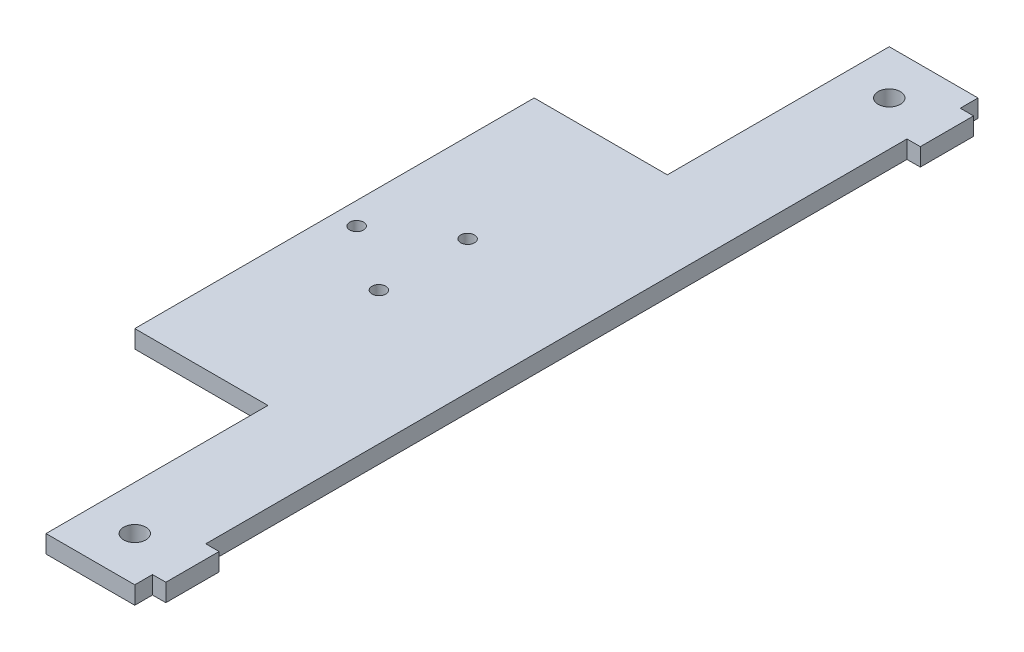
ISO-10303-21;
HEADER;
FILE_DESCRIPTION(('STEP AP214'),'2;1');
FILE_NAME('part.step','',(''),(''),'','','');
FILE_SCHEMA(('AUTOMOTIVE_DESIGN { 1 0 10303 214 1 1 1 1 }'));
ENDSEC;
DATA;
#1=APPLICATION_CONTEXT('core data for automotive mechanical design processes');
#2=APPLICATION_PROTOCOL_DEFINITION('international standard','automotive_design',2000,#1);
#3=PRODUCT_CONTEXT('',#1,'mechanical');
#4=PRODUCT('Part','Part','',(#3));
#5=PRODUCT_RELATED_PRODUCT_CATEGORY('part','',(#4));
#6=PRODUCT_DEFINITION_FORMATION('','',#4);
#7=PRODUCT_DEFINITION_CONTEXT('part definition',#1,'design');
#8=PRODUCT_DEFINITION('design','',#6,#7);
#9=PRODUCT_DEFINITION_SHAPE('','',#8);
#10=(LENGTH_UNIT() NAMED_UNIT(*) SI_UNIT(.MILLI.,.METRE.));
#11=(NAMED_UNIT(*) PLANE_ANGLE_UNIT() SI_UNIT($,.RADIAN.));
#12=(NAMED_UNIT(*) SI_UNIT($,.STERADIAN.) SOLID_ANGLE_UNIT());
#13=UNCERTAINTY_MEASURE_WITH_UNIT(LENGTH_MEASURE(1.E-05),#10,'distance_accuracy_value','');
#14=(GEOMETRIC_REPRESENTATION_CONTEXT(3) GLOBAL_UNCERTAINTY_ASSIGNED_CONTEXT((#13)) GLOBAL_UNIT_ASSIGNED_CONTEXT((#10,
#11,#12)) REPRESENTATION_CONTEXT('',''));
#15=CARTESIAN_POINT('',(0.,0.,0.));
#16=DIRECTION('',(0.,0.,1.));
#17=DIRECTION('',(1.,0.,0.));
#18=AXIS2_PLACEMENT_3D('',#15,#16,#17);
#19=CARTESIAN_POINT('',(0.,4.,0.));
#20=DIRECTION('',(0.,-1.,0.));
#21=DIRECTION('',(0.,0.,-1.));
#22=AXIS2_PLACEMENT_3D('',#19,#20,#21);
#23=PLANE('',#22);
#24=CARTESIAN_POINT('',(4.99999999999994,4.,-125.));
#25=DIRECTION('',(0.,1.,0.));
#26=DIRECTION('',(0.,0.,1.));
#27=AXIS2_PLACEMENT_3D('',#24,#25,#26);
#28=CIRCLE('',#27,1.55000000000002);
#29=CARTESIAN_POINT('',(4.99999999999994,4.,-123.45));
#30=VERTEX_POINT('',#29);
#31=EDGE_CURVE('E300',#30,#30,#28,.T.);
#32=ORIENTED_EDGE('',*,*,#31,.F.);
#33=EDGE_LOOP('',(#32));
#34=FACE_BOUND('',#33,.T.);
#35=CARTESIAN_POINT('',(19.9999999999999,4.,-115.));
#36=DIRECTION('',(0.,1.,0.));
#37=DIRECTION('',(0.,0.,1.));
#38=AXIS2_PLACEMENT_3D('',#35,#36,#37);
#39=CIRCLE('',#38,1.54999999999999);
#40=CARTESIAN_POINT('',(19.9999999999999,4.,-113.45));
#41=VERTEX_POINT('',#40);
#42=EDGE_CURVE('E304',#41,#41,#39,.T.);
#43=ORIENTED_EDGE('',*,*,#42,.F.);
#44=EDGE_LOOP('',(#43));
#45=FACE_BOUND('',#44,.T.);
#46=CARTESIAN_POINT('',(20.,4.,-135.));
#47=DIRECTION('',(0.,1.,0.));
#48=DIRECTION('',(0.,0.,1.));
#49=AXIS2_PLACEMENT_3D('',#46,#47,#48);
#50=CIRCLE('',#49,1.54999999999999);
#51=CARTESIAN_POINT('',(20.,4.,-133.45));
#52=VERTEX_POINT('',#51);
#53=EDGE_CURVE('E299',#52,#52,#50,.T.);
#54=ORIENTED_EDGE('',*,*,#53,.F.);
#55=EDGE_LOOP('',(#54));
#56=FACE_BOUND('',#55,.T.);
#57=DIRECTION('',(1.,0.,0.));
#58=VECTOR('',#57,1.);
#59=CARTESIAN_POINT('',(29.9999999999996,4.,-30.0000000000003));
#60=LINE('',#59,#58);
#61=CARTESIAN_POINT('',(29.9999999999996,4.,-30.0000000000003));
#62=VERTEX_POINT('',#61);
#63=CARTESIAN_POINT('',(49.9999999999999,4.,-30.0000000000003));
#64=VERTEX_POINT('',#63);
#65=EDGE_CURVE('E325',#62,#64,#60,.T.);
#66=ORIENTED_EDGE('',*,*,#65,.T.);
#67=DIRECTION('',(0.,0.,1.));
#68=VECTOR('',#67,1.);
#69=CARTESIAN_POINT('',(49.9999999999999,4.,-1.11022302462516E-13));
#70=LINE('',#69,#68);
#71=CARTESIAN_POINT('',(49.9999999999999,4.,-34.));
#72=VERTEX_POINT('',#71);
#73=EDGE_CURVE('E152',#72,#64,#70,.T.);
#74=ORIENTED_EDGE('',*,*,#73,.F.);
#75=DIRECTION('',(-1.,0.,0.));
#76=VECTOR('',#75,1.);
#77=CARTESIAN_POINT('',(49.9999999999999,4.,-34.));
#78=LINE('',#77,#76);
#79=CARTESIAN_POINT('',(52.9999999999999,4.,-34.));
#80=VERTEX_POINT('',#79);
#81=EDGE_CURVE('E251',#80,#72,#78,.T.);
#82=ORIENTED_EDGE('',*,*,#81,.F.);
#83=DIRECTION('',(0.,0.,1.));
#84=VECTOR('',#83,1.);
#85=CARTESIAN_POINT('',(52.9999999999999,4.,-46.));
#86=LINE('',#85,#84);
#87=CARTESIAN_POINT('',(52.9999999999999,4.,-46.));
#88=VERTEX_POINT('',#87);
#89=EDGE_CURVE('E276',#88,#80,#86,.T.);
#90=ORIENTED_EDGE('',*,*,#89,.F.);
#91=DIRECTION('',(1.,0.,0.));
#92=VECTOR('',#91,1.);
#93=CARTESIAN_POINT('',(49.9999999999999,4.,-46.));
#94=LINE('',#93,#92);
#95=CARTESIAN_POINT('',(49.9999999999999,4.,-46.));
#96=VERTEX_POINT('',#95);
#97=EDGE_CURVE('E273',#96,#88,#94,.T.);
#98=ORIENTED_EDGE('',*,*,#97,.F.);
#99=DIRECTION('',(0.,0.,1.));
#100=VECTOR('',#99,1.);
#101=CARTESIAN_POINT('',(49.9999999999999,4.,-200.));
#102=LINE('',#101,#100);
#103=CARTESIAN_POINT('',(50.0000000000004,4.,-204.000000000001));
#104=VERTEX_POINT('',#103);
#105=EDGE_CURVE('E345',#104,#96,#102,.T.);
#106=ORIENTED_EDGE('',*,*,#105,.F.);
#107=DIRECTION('',(-1.,0.,0.));
#108=VECTOR('',#107,1.);
#109=CARTESIAN_POINT('',(50.0000000000004,4.,-204.000000000001));
#110=LINE('',#109,#108);
#111=CARTESIAN_POINT('',(53.0000000000004,4.,-204.000000000001));
#112=VERTEX_POINT('',#111);
#113=EDGE_CURVE('E267',#112,#104,#110,.T.);
#114=ORIENTED_EDGE('',*,*,#113,.F.);
#115=DIRECTION('',(0.,0.,1.));
#116=VECTOR('',#115,1.);
#117=CARTESIAN_POINT('',(53.0000000000004,4.,-204.000000000001));
#118=LINE('',#117,#116);
#119=CARTESIAN_POINT('',(53.0000000000005,4.,-216.000000000001));
#120=VERTEX_POINT('',#119);
#121=EDGE_CURVE('E265',#120,#112,#118,.T.);
#122=ORIENTED_EDGE('',*,*,#121,.F.);
#123=DIRECTION('',(1.,0.,0.));
#124=VECTOR('',#123,1.);
#125=CARTESIAN_POINT('',(50.0000000000005,4.,-216.000000000001));
#126=LINE('',#125,#124);
#127=CARTESIAN_POINT('',(50.0000000000005,4.,-216.000000000001));
#128=VERTEX_POINT('',#127);
#129=EDGE_CURVE('E246',#128,#120,#126,.T.);
#130=ORIENTED_EDGE('',*,*,#129,.F.);
#131=DIRECTION('',(0.,0.,1.));
#132=VECTOR('',#131,1.);
#133=CARTESIAN_POINT('',(50.0000000000005,4.,-216.000000000001));
#134=LINE('',#133,#132);
#135=CARTESIAN_POINT('',(50.0000000000004,4.,-220.));
#136=VERTEX_POINT('',#135);
#137=EDGE_CURVE('E254',#136,#128,#134,.T.);
#138=ORIENTED_EDGE('',*,*,#137,.F.);
#139=DIRECTION('',(1.,0.,0.));
#140=VECTOR('',#139,1.);
#141=CARTESIAN_POINT('',(5.55111512312578E-13,4.,-220.000000000001));
#142=LINE('',#141,#140);
#143=CARTESIAN_POINT('',(30.0000000000006,4.,-220.000000000001));
#144=VERTEX_POINT('',#143);
#145=EDGE_CURVE('E309',#144,#136,#142,.T.);
#146=ORIENTED_EDGE('',*,*,#145,.F.);
#147=DIRECTION('',(0.,0.,1.));
#148=VECTOR('',#147,1.);
#149=CARTESIAN_POINT('',(30.0000000000006,4.,-220.000000000001));
#150=LINE('',#149,#148);
#151=CARTESIAN_POINT('',(30.0000000000002,4.,-170.000000000001));
#152=VERTEX_POINT('',#151);
#153=EDGE_CURVE('E315',#144,#152,#150,.T.);
#154=ORIENTED_EDGE('',*,*,#153,.T.);
#155=DIRECTION('',(-1.,0.,0.));
#156=VECTOR('',#155,1.);
#157=CARTESIAN_POINT('',(30.0000000000002,4.,-170.000000000001));
#158=LINE('',#157,#156);
#159=CARTESIAN_POINT('',(1.66533453693773E-13,4.,-170.000000000001));
#160=VERTEX_POINT('',#159);
#161=EDGE_CURVE('E312',#152,#160,#158,.T.);
#162=ORIENTED_EDGE('',*,*,#161,.T.);
#163=DIRECTION('',(0.,0.,1.));
#164=VECTOR('',#163,1.);
#165=CARTESIAN_POINT('',(0.,4.,0.));
#166=LINE('',#165,#164);
#167=CARTESIAN_POINT('',(-2.49465412897243E-13,4.,-80.0000000000004));
#168=VERTEX_POINT('',#167);
#169=EDGE_CURVE('E360',#160,#168,#166,.T.);
#170=ORIENTED_EDGE('',*,*,#169,.T.);
#171=DIRECTION('',(1.,0.,0.));
#172=VECTOR('',#171,1.);
#173=CARTESIAN_POINT('',(-2.49465412897243E-13,4.,-80.0000000000004));
#174=LINE('',#173,#172);
#175=CARTESIAN_POINT('',(29.9999999999998,4.,-80.0000000000003));
#176=VERTEX_POINT('',#175);
#177=EDGE_CURVE('E311',#168,#176,#174,.T.);
#178=ORIENTED_EDGE('',*,*,#177,.T.);
#179=DIRECTION('',(0.,0.,-1.));
#180=VECTOR('',#179,1.);
#181=CARTESIAN_POINT('',(29.9999999999995,4.,-3.33066907387547E-13));
#182=LINE('',#181,#180);
#183=EDGE_CURVE('E333',#62,#176,#182,.T.);
#184=ORIENTED_EDGE('',*,*,#183,.F.);
#185=EDGE_LOOP('',(#66,#74,#82,#90,#98,#106,#114,#122,#130,#138,#146,#154,#162,#170,#178,#184));
#186=FACE_BOUND('',#185,.T.);
#187=CARTESIAN_POINT('',(39.9999999999999,4.,-210.));
#188=DIRECTION('',(0.,1.,0.));
#189=DIRECTION('',(0.,0.,1.));
#190=AXIS2_PLACEMENT_3D('',#187,#188,#189);
#191=CIRCLE('',#190,2.5);
#192=CARTESIAN_POINT('',(39.9999999999999,4.,-207.5));
#193=VERTEX_POINT('',#192);
#194=EDGE_CURVE('E354',#193,#193,#191,.T.);
#195=ORIENTED_EDGE('',*,*,#194,.F.);
#196=EDGE_LOOP('',(#195));
#197=FACE_BOUND('',#196,.T.);
#198=CARTESIAN_POINT('',(39.9999999999999,4.,-40.));
#199=DIRECTION('',(0.,1.,0.));
#200=DIRECTION('',(0.,0.,1.));
#201=AXIS2_PLACEMENT_3D('',#198,#199,#200);
#202=CIRCLE('',#201,2.5);
#203=CARTESIAN_POINT('',(39.9999999999999,4.,-37.5));
#204=VERTEX_POINT('',#203);
#205=EDGE_CURVE('E348',#204,#204,#202,.T.);
#206=ORIENTED_EDGE('',*,*,#205,.F.);
#207=EDGE_LOOP('',(#206));
#208=FACE_BOUND('',#207,.T.);
#209=ADVANCED_FACE('F129',(#34,#45,#56,#186,#197,#208),#23,.F.);
#210=CARTESIAN_POINT('',(0.,0.,0.));
#211=DIRECTION('',(0.,-1.,0.));
#212=DIRECTION('',(0.,0.,-1.));
#213=AXIS2_PLACEMENT_3D('',#210,#211,#212);
#214=PLANE('',#213);
#215=DIRECTION('',(0.,0.,-1.));
#216=VECTOR('',#215,1.);
#217=CARTESIAN_POINT('',(49.9999999999999,0.,0.));
#218=LINE('',#217,#216);
#219=CARTESIAN_POINT('',(49.9999999999999,0.,-30.0000000000003));
#220=VERTEX_POINT('',#219);
#221=CARTESIAN_POINT('',(49.9999999999999,0.,-34.));
#222=VERTEX_POINT('',#221);
#223=EDGE_CURVE('E283',#220,#222,#218,.T.);
#224=ORIENTED_EDGE('',*,*,#223,.F.);
#225=DIRECTION('',(-1.,0.,0.));
#226=VECTOR('',#225,1.);
#227=CARTESIAN_POINT('',(0.,0.,-30.0000000000004));
#228=LINE('',#227,#226);
#229=CARTESIAN_POINT('',(29.9999999999996,0.,-30.0000000000003));
#230=VERTEX_POINT('',#229);
#231=EDGE_CURVE('E370',#220,#230,#228,.T.);
#232=ORIENTED_EDGE('',*,*,#231,.T.);
#233=DIRECTION('',(0.,0.,1.));
#234=VECTOR('',#233,1.);
#235=CARTESIAN_POINT('',(29.9999999999995,0.,1.01481323344642E-13));
#236=LINE('',#235,#234);
#237=CARTESIAN_POINT('',(29.9999999999998,0.,-80.0000000000003));
#238=VERTEX_POINT('',#237);
#239=EDGE_CURVE('E367',#238,#230,#236,.T.);
#240=ORIENTED_EDGE('',*,*,#239,.F.);
#241=DIRECTION('',(-1.,0.,0.));
#242=VECTOR('',#241,1.);
#243=CARTESIAN_POINT('',(2.96059473233376E-13,0.,-80.0000000000004));
#244=LINE('',#243,#242);
#245=CARTESIAN_POINT('',(-2.49465412897243E-13,0.,-80.0000000000004));
#246=VERTEX_POINT('',#245);
#247=EDGE_CURVE('E330',#238,#246,#244,.T.);
#248=ORIENTED_EDGE('',*,*,#247,.T.);
#249=DIRECTION('',(0.,0.,1.));
#250=VECTOR('',#249,1.);
#251=CARTESIAN_POINT('',(0.,0.,0.));
#252=LINE('',#251,#250);
#253=CARTESIAN_POINT('',(1.66533453693773E-13,0.,-170.000000000001));
#254=VERTEX_POINT('',#253);
#255=EDGE_CURVE('E357',#254,#246,#252,.T.);
#256=ORIENTED_EDGE('',*,*,#255,.F.);
#257=DIRECTION('',(1.,0.,0.));
#258=VECTOR('',#257,1.);
#259=CARTESIAN_POINT('',(1.25825276124185E-12,0.,-170.000000000001));
#260=LINE('',#259,#258);
#261=CARTESIAN_POINT('',(30.0000000000002,0.,-170.000000000001));
#262=VERTEX_POINT('',#261);
#263=EDGE_CURVE('E342',#254,#262,#260,.T.);
#264=ORIENTED_EDGE('',*,*,#263,.T.);
#265=DIRECTION('',(0.,0.,-1.));
#266=VECTOR('',#265,1.);
#267=CARTESIAN_POINT('',(29.9999999999991,0.,1.99840144432522E-13));
#268=LINE('',#267,#266);
#269=CARTESIAN_POINT('',(30.0000000000006,0.,-220.000000000001));
#270=VERTEX_POINT('',#269);
#271=EDGE_CURVE('E374',#262,#270,#268,.T.);
#272=ORIENTED_EDGE('',*,*,#271,.T.);
#273=DIRECTION('',(-1.,0.,0.));
#274=VECTOR('',#273,1.);
#275=CARTESIAN_POINT('',(1.5265566588596E-12,0.,-220.000000000001));
#276=LINE('',#275,#274);
#277=CARTESIAN_POINT('',(50.0000000000004,0.,-220.000000000001));
#278=VERTEX_POINT('',#277);
#279=EDGE_CURVE('E372',#278,#270,#276,.T.);
#280=ORIENTED_EDGE('',*,*,#279,.F.);
#281=DIRECTION('',(0.,0.,-1.));
#282=VECTOR('',#281,1.);
#283=CARTESIAN_POINT('',(50.0000000000043,0.,-8.67361737988514E-13));
#284=LINE('',#283,#282);
#285=CARTESIAN_POINT('',(50.0000000000005,0.,-216.000000000001));
#286=VERTEX_POINT('',#285);
#287=EDGE_CURVE('E144',#286,#278,#284,.T.);
#288=ORIENTED_EDGE('',*,*,#287,.F.);
#289=DIRECTION('',(-1.,0.,0.));
#290=VECTOR('',#289,1.);
#291=CARTESIAN_POINT('',(0.,0.,-216.000000000001));
#292=LINE('',#291,#290);
#293=CARTESIAN_POINT('',(53.0000000000005,0.,-216.000000000001));
#294=VERTEX_POINT('',#293);
#295=EDGE_CURVE('E249',#294,#286,#292,.T.);
#296=ORIENTED_EDGE('',*,*,#295,.F.);
#297=DIRECTION('',(0.,0.,-1.));
#298=VECTOR('',#297,1.);
#299=CARTESIAN_POINT('',(52.9999999999993,0.,3.06467814089232E-13));
#300=LINE('',#299,#298);
#301=CARTESIAN_POINT('',(53.0000000000004,0.,-204.000000000001));
#302=VERTEX_POINT('',#301);
#303=EDGE_CURVE('E388',#302,#294,#300,.T.);
#304=ORIENTED_EDGE('',*,*,#303,.F.);
#305=DIRECTION('',(1.,0.,0.));
#306=VECTOR('',#305,1.);
#307=CARTESIAN_POINT('',(0.,0.,-204.000000000001));
#308=LINE('',#307,#306);
#309=CARTESIAN_POINT('',(50.0000000000004,0.,-204.000000000001));
#310=VERTEX_POINT('',#309);
#311=EDGE_CURVE('E390',#310,#302,#308,.T.);
#312=ORIENTED_EDGE('',*,*,#311,.F.);
#313=DIRECTION('',(0.,0.,-1.));
#314=VECTOR('',#313,1.);
#315=CARTESIAN_POINT('',(49.9999999999999,0.,0.));
#316=LINE('',#315,#314);
#317=CARTESIAN_POINT('',(49.9999999999999,0.,-46.));
#318=VERTEX_POINT('',#317);
#319=EDGE_CURVE('E363',#318,#310,#316,.T.);
#320=ORIENTED_EDGE('',*,*,#319,.F.);
#321=DIRECTION('',(-1.,0.,0.));
#322=VECTOR('',#321,1.);
#323=CARTESIAN_POINT('',(0.,0.,-46.));
#324=LINE('',#323,#322);
#325=CARTESIAN_POINT('',(52.9999999999999,0.,-46.));
#326=VERTEX_POINT('',#325);
#327=EDGE_CURVE('E392',#326,#318,#324,.T.);
#328=ORIENTED_EDGE('',*,*,#327,.F.);
#329=DIRECTION('',(0.,0.,-1.));
#330=VECTOR('',#329,1.);
#331=CARTESIAN_POINT('',(52.9999999999999,0.,0.));
#332=LINE('',#331,#330);
#333=CARTESIAN_POINT('',(52.9999999999999,0.,-34.));
#334=VERTEX_POINT('',#333);
#335=EDGE_CURVE('E137',#334,#326,#332,.T.);
#336=ORIENTED_EDGE('',*,*,#335,.F.);
#337=DIRECTION('',(1.,0.,0.));
#338=VECTOR('',#337,1.);
#339=CARTESIAN_POINT('',(0.,0.,-34.));
#340=LINE('',#339,#338);
#341=EDGE_CURVE('E12',#222,#334,#340,.T.);
#342=ORIENTED_EDGE('',*,*,#341,.F.);
#343=EDGE_LOOP('',(#224,#232,#240,#248,#256,#264,#272,#280,#288,#296,#304,#312,#320,#328,#336,#342));
#344=FACE_BOUND('',#343,.T.);
#345=CARTESIAN_POINT('',(4.99999999999994,0.,-125.));
#346=DIRECTION('',(0.,-1.,0.));
#347=DIRECTION('',(0.,0.,-1.));
#348=AXIS2_PLACEMENT_3D('',#345,#346,#347);
#349=CIRCLE('',#348,1.55000000000002);
#350=CARTESIAN_POINT('',(4.99999999999994,0.,-126.55));
#351=VERTEX_POINT('',#350);
#352=EDGE_CURVE('E320',#351,#351,#349,.T.);
#353=ORIENTED_EDGE('',*,*,#352,.F.);
#354=EDGE_LOOP('',(#353));
#355=FACE_BOUND('',#354,.T.);
#356=CARTESIAN_POINT('',(19.9999999999999,0.,-115.));
#357=DIRECTION('',(0.,-1.,0.));
#358=DIRECTION('',(0.,0.,-1.));
#359=AXIS2_PLACEMENT_3D('',#356,#357,#358);
#360=CIRCLE('',#359,1.54999999999999);
#361=CARTESIAN_POINT('',(19.9999999999999,0.,-116.55));
#362=VERTEX_POINT('',#361);
#363=EDGE_CURVE('E380',#362,#362,#360,.T.);
#364=ORIENTED_EDGE('',*,*,#363,.F.);
#365=EDGE_LOOP('',(#364));
#366=FACE_BOUND('',#365,.T.);
#367=CARTESIAN_POINT('',(20.,0.,-135.));
#368=DIRECTION('',(0.,-1.,0.));
#369=DIRECTION('',(0.,0.,-1.));
#370=AXIS2_PLACEMENT_3D('',#367,#368,#369);
#371=CIRCLE('',#370,1.54999999999999);
#372=CARTESIAN_POINT('',(20.,0.,-136.55));
#373=VERTEX_POINT('',#372);
#374=EDGE_CURVE('E303',#373,#373,#371,.T.);
#375=ORIENTED_EDGE('',*,*,#374,.F.);
#376=EDGE_LOOP('',(#375));
#377=FACE_BOUND('',#376,.T.);
#378=CARTESIAN_POINT('',(39.9999999999999,0.,-210.));
#379=DIRECTION('',(0.,1.,0.));
#380=DIRECTION('',(0.,0.,1.));
#381=AXIS2_PLACEMENT_3D('',#378,#379,#380);
#382=CIRCLE('',#381,2.5);
#383=CARTESIAN_POINT('',(39.9999999999999,0.,-207.5));
#384=VERTEX_POINT('',#383);
#385=EDGE_CURVE('E351',#384,#384,#382,.T.);
#386=ORIENTED_EDGE('',*,*,#385,.T.);
#387=EDGE_LOOP('',(#386));
#388=FACE_BOUND('',#387,.T.);
#389=CARTESIAN_POINT('',(39.9999999999999,0.,-40.));
#390=DIRECTION('',(0.,1.,0.));
#391=DIRECTION('',(0.,0.,1.));
#392=AXIS2_PLACEMENT_3D('',#389,#390,#391);
#393=CIRCLE('',#392,2.5);
#394=CARTESIAN_POINT('',(39.9999999999999,0.,-37.5));
#395=VERTEX_POINT('',#394);
#396=EDGE_CURVE('E347',#395,#395,#393,.T.);
#397=ORIENTED_EDGE('',*,*,#396,.T.);
#398=EDGE_LOOP('',(#397));
#399=FACE_BOUND('',#398,.T.);
#400=ADVANCED_FACE('F408',(#344,#355,#366,#377,#388,#399),#214,.T.);
#401=CARTESIAN_POINT('',(0.,4.,0.));
#402=DIRECTION('',(1.,0.,0.));
#403=DIRECTION('',(0.,0.,-1.));
#404=AXIS2_PLACEMENT_3D('',#401,#402,#403);
#405=PLANE('',#404);
#406=DIRECTION('',(0.,1.,0.));
#407=VECTOR('',#406,1.);
#408=CARTESIAN_POINT('',(1.66533453693773E-13,-6.,-170.000000000001));
#409=LINE('',#408,#407);
#410=EDGE_CURVE('E313',#254,#160,#409,.T.);
#411=ORIENTED_EDGE('',*,*,#410,.F.);
#412=ORIENTED_EDGE('',*,*,#255,.T.);
#413=DIRECTION('',(0.,1.,0.));
#414=VECTOR('',#413,1.);
#415=CARTESIAN_POINT('',(-2.49465412897243E-13,-6.,-80.0000000000004));
#416=LINE('',#415,#414);
#417=EDGE_CURVE('E328',#246,#168,#416,.T.);
#418=ORIENTED_EDGE('',*,*,#417,.T.);
#419=ORIENTED_EDGE('',*,*,#169,.F.);
#420=EDGE_LOOP('',(#411,#412,#418,#419));
#421=FACE_BOUND('',#420,.T.);
#422=ADVANCED_FACE('F131',(#421),#405,.F.);
#423=CARTESIAN_POINT('',(39.9999999999999,4.,-210.));
#424=DIRECTION('',(0.,-1.,0.));
#425=DIRECTION('',(0.,0.,-1.));
#426=AXIS2_PLACEMENT_3D('',#423,#424,#425);
#427=CYLINDRICAL_SURFACE('',#426,2.5);
#428=ORIENTED_EDGE('',*,*,#194,.T.);
#429=EDGE_LOOP('',(#428));
#430=FACE_BOUND('',#429,.T.);
#431=ORIENTED_EDGE('',*,*,#385,.F.);
#432=EDGE_LOOP('',(#431));
#433=FACE_BOUND('',#432,.T.);
#434=ADVANCED_FACE('F470',(#430,#433),#427,.F.);
#435=CARTESIAN_POINT('',(39.9999999999999,4.,-40.));
#436=DIRECTION('',(0.,-1.,0.));
#437=DIRECTION('',(0.,0.,-1.));
#438=AXIS2_PLACEMENT_3D('',#435,#436,#437);
#439=CYLINDRICAL_SURFACE('',#438,2.5);
#440=ORIENTED_EDGE('',*,*,#205,.T.);
#441=EDGE_LOOP('',(#440));
#442=FACE_BOUND('',#441,.T.);
#443=ORIENTED_EDGE('',*,*,#396,.F.);
#444=EDGE_LOOP('',(#443));
#445=FACE_BOUND('',#444,.T.);
#446=ADVANCED_FACE('F473',(#442,#445),#439,.F.);
#447=CARTESIAN_POINT('',(49.9999999999999,-6.,-200.));
#448=DIRECTION('',(-1.,0.,0.));
#449=DIRECTION('',(0.,0.,1.));
#450=AXIS2_PLACEMENT_3D('',#447,#448,#449);
#451=PLANE('',#450);
#452=ORIENTED_EDGE('',*,*,#319,.T.);
#453=DIRECTION('',(0.,1.,0.));
#454=VECTOR('',#453,1.);
#455=CARTESIAN_POINT('',(50.0000000000004,-6.,-204.000000000001));
#456=LINE('',#455,#454);
#457=EDGE_CURVE('E291',#310,#104,#456,.T.);
#458=ORIENTED_EDGE('',*,*,#457,.T.);
#459=ORIENTED_EDGE('',*,*,#105,.T.);
#460=DIRECTION('',(0.,1.,0.));
#461=VECTOR('',#460,1.);
#462=CARTESIAN_POINT('',(49.9999999999999,-6.,-46.));
#463=LINE('',#462,#461);
#464=EDGE_CURVE('E288',#318,#96,#463,.T.);
#465=ORIENTED_EDGE('',*,*,#464,.F.);
#466=EDGE_LOOP('',(#452,#458,#459,#465));
#467=FACE_BOUND('',#466,.T.);
#468=ADVANCED_FACE('F414',(#467),#451,.F.);
#469=CARTESIAN_POINT('',(30.0000000000002,-6.,-170.000000000001));
#470=DIRECTION('',(0.,0.,-1.));
#471=DIRECTION('',(-1.,0.,0.));
#472=AXIS2_PLACEMENT_3D('',#469,#470,#471);
#473=PLANE('',#472);
#474=ORIENTED_EDGE('',*,*,#410,.T.);
#475=ORIENTED_EDGE('',*,*,#161,.F.);
#476=DIRECTION('',(0.,1.,0.));
#477=VECTOR('',#476,1.);
#478=CARTESIAN_POINT('',(30.0000000000002,-6.,-170.000000000001));
#479=LINE('',#478,#477);
#480=EDGE_CURVE('E316',#262,#152,#479,.T.);
#481=ORIENTED_EDGE('',*,*,#480,.F.);
#482=ORIENTED_EDGE('',*,*,#263,.F.);
#483=EDGE_LOOP('',(#474,#475,#481,#482));
#484=FACE_BOUND('',#483,.T.);
#485=ADVANCED_FACE('F439',(#484),#473,.T.);
#486=CARTESIAN_POINT('',(30.0000000000006,-6.,-220.000000000001));
#487=DIRECTION('',(-1.,0.,0.));
#488=DIRECTION('',(0.,0.,1.));
#489=AXIS2_PLACEMENT_3D('',#486,#487,#488);
#490=PLANE('',#489);
#491=ORIENTED_EDGE('',*,*,#480,.T.);
#492=ORIENTED_EDGE('',*,*,#153,.F.);
#493=DIRECTION('',(0.,1.,0.));
#494=VECTOR('',#493,1.);
#495=CARTESIAN_POINT('',(30.0000000000006,-6.,-220.000000000001));
#496=LINE('',#495,#494);
#497=EDGE_CURVE('E318',#270,#144,#496,.T.);
#498=ORIENTED_EDGE('',*,*,#497,.F.);
#499=ORIENTED_EDGE('',*,*,#271,.F.);
#500=EDGE_LOOP('',(#491,#492,#498,#499));
#501=FACE_BOUND('',#500,.T.);
#502=ADVANCED_FACE('F444',(#501),#490,.T.);
#503=CARTESIAN_POINT('',(5.55111512312578E-13,-6.,-220.000000000001));
#504=DIRECTION('',(0.,0.,1.));
#505=DIRECTION('',(1.,0.,0.));
#506=AXIS2_PLACEMENT_3D('',#503,#504,#505);
#507=PLANE('',#506);
#508=ORIENTED_EDGE('',*,*,#145,.T.);
#509=DIRECTION('',(0.,-1.,0.));
#510=VECTOR('',#509,1.);
#511=CARTESIAN_POINT('',(50.0000000000004,-6.,-220.000000000001));
#512=LINE('',#511,#510);
#513=EDGE_CURVE('E256',#136,#278,#512,.T.);
#514=ORIENTED_EDGE('',*,*,#513,.T.);
#515=ORIENTED_EDGE('',*,*,#279,.T.);
#516=ORIENTED_EDGE('',*,*,#497,.T.);
#517=EDGE_LOOP('',(#508,#514,#515,#516));
#518=FACE_BOUND('',#517,.T.);
#519=ADVANCED_FACE('F447',(#518),#507,.F.);
#520=CARTESIAN_POINT('',(29.9999999999996,-6.,-30.0000000000003));
#521=DIRECTION('',(0.,0.,1.));
#522=DIRECTION('',(1.,0.,0.));
#523=AXIS2_PLACEMENT_3D('',#520,#521,#522);
#524=PLANE('',#523);
#525=DIRECTION('',(0.,-1.,0.));
#526=VECTOR('',#525,1.);
#527=CARTESIAN_POINT('',(49.9999999999999,-6.,-30.0000000000003));
#528=LINE('',#527,#526);
#529=EDGE_CURVE('E377',#64,#220,#528,.T.);
#530=ORIENTED_EDGE('',*,*,#529,.F.);
#531=ORIENTED_EDGE('',*,*,#65,.F.);
#532=DIRECTION('',(0.,1.,0.));
#533=VECTOR('',#532,1.);
#534=CARTESIAN_POINT('',(29.9999999999996,-6.,-30.0000000000003));
#535=LINE('',#534,#533);
#536=EDGE_CURVE('E327',#230,#62,#535,.T.);
#537=ORIENTED_EDGE('',*,*,#536,.F.);
#538=ORIENTED_EDGE('',*,*,#231,.F.);
#539=EDGE_LOOP('',(#530,#531,#537,#538));
#540=FACE_BOUND('',#539,.T.);
#541=ADVANCED_FACE('F426',(#540),#524,.T.);
#542=CARTESIAN_POINT('',(-2.49465412897243E-13,-6.,-80.0000000000004));
#543=DIRECTION('',(0.,0.,1.));
#544=DIRECTION('',(1.,0.,0.));
#545=AXIS2_PLACEMENT_3D('',#542,#543,#544);
#546=PLANE('',#545);
#547=DIRECTION('',(0.,1.,0.));
#548=VECTOR('',#547,1.);
#549=CARTESIAN_POINT('',(29.9999999999998,-6.,-80.0000000000003));
#550=LINE('',#549,#548);
#551=EDGE_CURVE('E336',#238,#176,#550,.T.);
#552=ORIENTED_EDGE('',*,*,#551,.T.);
#553=ORIENTED_EDGE('',*,*,#177,.F.);
#554=ORIENTED_EDGE('',*,*,#417,.F.);
#555=ORIENTED_EDGE('',*,*,#247,.F.);
#556=EDGE_LOOP('',(#552,#553,#554,#555));
#557=FACE_BOUND('',#556,.T.);
#558=ADVANCED_FACE('F454',(#557),#546,.T.);
#559=CARTESIAN_POINT('',(29.9999999999995,-6.,-3.33066907387547E-13));
#560=DIRECTION('',(1.,0.,0.));
#561=DIRECTION('',(0.,0.,-1.));
#562=AXIS2_PLACEMENT_3D('',#559,#560,#561);
#563=PLANE('',#562);
#564=ORIENTED_EDGE('',*,*,#239,.T.);
#565=ORIENTED_EDGE('',*,*,#536,.T.);
#566=ORIENTED_EDGE('',*,*,#183,.T.);
#567=ORIENTED_EDGE('',*,*,#551,.F.);
#568=EDGE_LOOP('',(#564,#565,#566,#567));
#569=FACE_BOUND('',#568,.T.);
#570=ADVANCED_FACE('F430',(#569),#563,.F.);
#571=CARTESIAN_POINT('',(20.,-6.,-135.));
#572=DIRECTION('',(0.,1.,0.));
#573=DIRECTION('',(0.,0.,1.));
#574=AXIS2_PLACEMENT_3D('',#571,#572,#573);
#575=CYLINDRICAL_SURFACE('',#574,1.54999999999999);
#576=ORIENTED_EDGE('',*,*,#374,.T.);
#577=EDGE_LOOP('',(#576));
#578=FACE_BOUND('',#577,.T.);
#579=ORIENTED_EDGE('',*,*,#53,.T.);
#580=EDGE_LOOP('',(#579));
#581=FACE_BOUND('',#580,.T.);
#582=ADVANCED_FACE('F482',(#578,#581),#575,.F.);
#583=CARTESIAN_POINT('',(19.9999999999999,-6.,-115.));
#584=DIRECTION('',(0.,1.,0.));
#585=DIRECTION('',(0.,0.,1.));
#586=AXIS2_PLACEMENT_3D('',#583,#584,#585);
#587=CYLINDRICAL_SURFACE('',#586,1.54999999999999);
#588=ORIENTED_EDGE('',*,*,#363,.T.);
#589=EDGE_LOOP('',(#588));
#590=FACE_BOUND('',#589,.T.);
#591=ORIENTED_EDGE('',*,*,#42,.T.);
#592=EDGE_LOOP('',(#591));
#593=FACE_BOUND('',#592,.T.);
#594=ADVANCED_FACE('F519',(#590,#593),#587,.F.);
#595=CARTESIAN_POINT('',(4.99999999999994,-6.,-125.));
#596=DIRECTION('',(0.,1.,0.));
#597=DIRECTION('',(0.,0.,1.));
#598=AXIS2_PLACEMENT_3D('',#595,#596,#597);
#599=CYLINDRICAL_SURFACE('',#598,1.55000000000002);
#600=ORIENTED_EDGE('',*,*,#352,.T.);
#601=EDGE_LOOP('',(#600));
#602=FACE_BOUND('',#601,.T.);
#603=ORIENTED_EDGE('',*,*,#31,.T.);
#604=EDGE_LOOP('',(#603));
#605=FACE_BOUND('',#604,.T.);
#606=ADVANCED_FACE('F526',(#602,#605),#599,.F.);
#607=CARTESIAN_POINT('',(49.9999999999999,-6.,-46.));
#608=DIRECTION('',(0.,0.,1.));
#609=DIRECTION('',(1.,0.,0.));
#610=AXIS2_PLACEMENT_3D('',#607,#608,#609);
#611=PLANE('',#610);
#612=ORIENTED_EDGE('',*,*,#327,.T.);
#613=ORIENTED_EDGE('',*,*,#464,.T.);
#614=ORIENTED_EDGE('',*,*,#97,.T.);
#615=DIRECTION('',(0.,1.,0.));
#616=VECTOR('',#615,1.);
#617=CARTESIAN_POINT('',(52.9999999999999,-6.,-46.));
#618=LINE('',#617,#616);
#619=EDGE_CURVE('E286',#326,#88,#618,.T.);
#620=ORIENTED_EDGE('',*,*,#619,.F.);
#621=EDGE_LOOP('',(#612,#613,#614,#620));
#622=FACE_BOUND('',#621,.T.);
#623=ADVANCED_FACE('F403',(#622),#611,.F.);
#624=CARTESIAN_POINT('',(52.9999999999999,-6.,-46.));
#625=DIRECTION('',(-1.,0.,0.));
#626=DIRECTION('',(0.,0.,1.));
#627=AXIS2_PLACEMENT_3D('',#624,#625,#626);
#628=PLANE('',#627);
#629=ORIENTED_EDGE('',*,*,#335,.T.);
#630=ORIENTED_EDGE('',*,*,#619,.T.);
#631=ORIENTED_EDGE('',*,*,#89,.T.);
#632=DIRECTION('',(0.,1.,0.));
#633=VECTOR('',#632,1.);
#634=CARTESIAN_POINT('',(52.9999999999999,-6.,-34.));
#635=LINE('',#634,#633);
#636=EDGE_CURVE('E284',#334,#80,#635,.T.);
#637=ORIENTED_EDGE('',*,*,#636,.F.);
#638=EDGE_LOOP('',(#629,#630,#631,#637));
#639=FACE_BOUND('',#638,.T.);
#640=ADVANCED_FACE('F398',(#639),#628,.F.);
#641=CARTESIAN_POINT('',(49.9999999999999,-6.,-1.11022302462516E-13));
#642=DIRECTION('',(-1.,0.,0.));
#643=DIRECTION('',(0.,0.,1.));
#644=AXIS2_PLACEMENT_3D('',#641,#642,#643);
#645=PLANE('',#644);
#646=ORIENTED_EDGE('',*,*,#223,.T.);
#647=DIRECTION('',(0.,1.,0.));
#648=VECTOR('',#647,1.);
#649=CARTESIAN_POINT('',(49.9999999999999,-6.,-34.));
#650=LINE('',#649,#648);
#651=EDGE_CURVE('E281',#222,#72,#650,.T.);
#652=ORIENTED_EDGE('',*,*,#651,.T.);
#653=ORIENTED_EDGE('',*,*,#73,.T.);
#654=ORIENTED_EDGE('',*,*,#529,.T.);
#655=EDGE_LOOP('',(#646,#652,#653,#654));
#656=FACE_BOUND('',#655,.T.);
#657=ADVANCED_FACE('F548',(#656),#645,.F.);
#658=CARTESIAN_POINT('',(49.9999999999999,-6.,-34.));
#659=DIRECTION('',(0.,0.,-1.));
#660=DIRECTION('',(-1.,0.,0.));
#661=AXIS2_PLACEMENT_3D('',#658,#659,#660);
#662=PLANE('',#661);
#663=ORIENTED_EDGE('',*,*,#341,.T.);
#664=ORIENTED_EDGE('',*,*,#636,.T.);
#665=ORIENTED_EDGE('',*,*,#81,.T.);
#666=ORIENTED_EDGE('',*,*,#651,.F.);
#667=EDGE_LOOP('',(#663,#664,#665,#666));
#668=FACE_BOUND('',#667,.T.);
#669=ADVANCED_FACE('F421',(#668),#662,.F.);
#670=CARTESIAN_POINT('',(50.0000000000004,-6.,-204.000000000001));
#671=DIRECTION('',(0.,0.,-1.));
#672=DIRECTION('',(-1.,0.,0.));
#673=AXIS2_PLACEMENT_3D('',#670,#671,#672);
#674=PLANE('',#673);
#675=ORIENTED_EDGE('',*,*,#311,.T.);
#676=DIRECTION('',(0.,1.,0.));
#677=VECTOR('',#676,1.);
#678=CARTESIAN_POINT('',(53.0000000000004,-6.,-204.000000000001));
#679=LINE('',#678,#677);
#680=EDGE_CURVE('E294',#302,#112,#679,.T.);
#681=ORIENTED_EDGE('',*,*,#680,.T.);
#682=ORIENTED_EDGE('',*,*,#113,.T.);
#683=ORIENTED_EDGE('',*,*,#457,.F.);
#684=EDGE_LOOP('',(#675,#681,#682,#683));
#685=FACE_BOUND('',#684,.T.);
#686=ADVANCED_FACE('F416',(#685),#674,.F.);
#687=CARTESIAN_POINT('',(53.0000000000004,-6.,-204.000000000001));
#688=DIRECTION('',(-1.,0.,0.));
#689=DIRECTION('',(0.,0.,1.));
#690=AXIS2_PLACEMENT_3D('',#687,#688,#689);
#691=PLANE('',#690);
#692=ORIENTED_EDGE('',*,*,#303,.T.);
#693=DIRECTION('',(0.,1.,0.));
#694=VECTOR('',#693,1.);
#695=CARTESIAN_POINT('',(53.0000000000005,-6.,-216.000000000001));
#696=LINE('',#695,#694);
#697=EDGE_CURVE('E250',#294,#120,#696,.T.);
#698=ORIENTED_EDGE('',*,*,#697,.T.);
#699=ORIENTED_EDGE('',*,*,#121,.T.);
#700=ORIENTED_EDGE('',*,*,#680,.F.);
#701=EDGE_LOOP('',(#692,#698,#699,#700));
#702=FACE_BOUND('',#701,.T.);
#703=ADVANCED_FACE('F567',(#702),#691,.F.);
#704=CARTESIAN_POINT('',(50.0000000000005,-6.,-216.000000000001));
#705=DIRECTION('',(0.,0.,1.));
#706=DIRECTION('',(1.,0.,0.));
#707=AXIS2_PLACEMENT_3D('',#704,#705,#706);
#708=PLANE('',#707);
#709=ORIENTED_EDGE('',*,*,#295,.T.);
#710=DIRECTION('',(0.,1.,0.));
#711=VECTOR('',#710,1.);
#712=CARTESIAN_POINT('',(50.0000000000005,-6.,-216.000000000001));
#713=LINE('',#712,#711);
#714=EDGE_CURVE('E241',#286,#128,#713,.T.);
#715=ORIENTED_EDGE('',*,*,#714,.T.);
#716=ORIENTED_EDGE('',*,*,#129,.T.);
#717=ORIENTED_EDGE('',*,*,#697,.F.);
#718=EDGE_LOOP('',(#709,#715,#716,#717));
#719=FACE_BOUND('',#718,.T.);
#720=ADVANCED_FACE('F243',(#719),#708,.F.);
#721=CARTESIAN_POINT('',(50.0000000000005,-6.,-216.000000000001));
#722=DIRECTION('',(-1.,0.,0.));
#723=DIRECTION('',(0.,0.,1.));
#724=AXIS2_PLACEMENT_3D('',#721,#722,#723);
#725=PLANE('',#724);
#726=ORIENTED_EDGE('',*,*,#287,.T.);
#727=ORIENTED_EDGE('',*,*,#513,.F.);
#728=ORIENTED_EDGE('',*,*,#137,.T.);
#729=ORIENTED_EDGE('',*,*,#714,.F.);
#730=EDGE_LOOP('',(#726,#727,#728,#729));
#731=FACE_BOUND('',#730,.T.);
#732=ADVANCED_FACE('F255',(#731),#725,.F.);
#733=CLOSED_SHELL('',(#209,#400,#422,#434,#446,#468,#485,#502,#519,#541,#558,#570,#582,#594,
#606,#623,#640,#657,#669,#686,#703,#720,#732));
#734=MANIFOLD_SOLID_BREP('B2',#733);
#735=ADVANCED_BREP_SHAPE_REPRESENTATION('',(#18,#734),#14);
#736=SHAPE_DEFINITION_REPRESENTATION(#9,#735);
ENDSEC;
END-ISO-10303-21;
